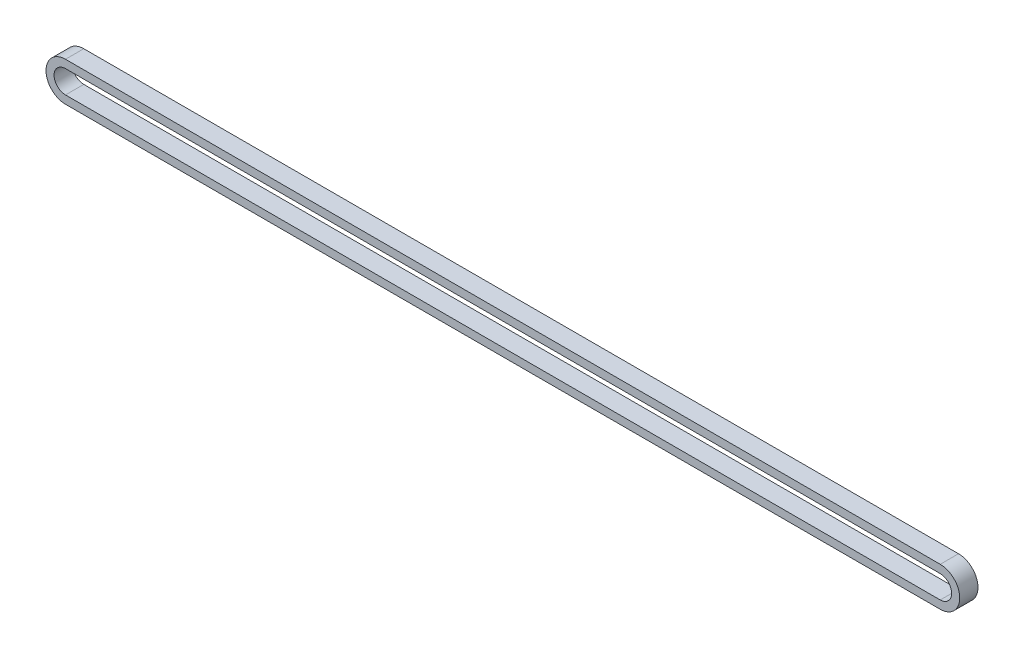
ISO-10303-21;
HEADER;
FILE_DESCRIPTION(('STEP AP214'),'2;1');
FILE_NAME('part.step','',(''),(''),'','','');
FILE_SCHEMA(('AUTOMOTIVE_DESIGN { 1 0 10303 214 1 1 1 1 }'));
ENDSEC;
DATA;
#1=APPLICATION_CONTEXT('core data for automotive mechanical design processes');
#2=APPLICATION_PROTOCOL_DEFINITION('international standard','automotive_design',2000,#1);
#3=PRODUCT_CONTEXT('',#1,'mechanical');
#4=PRODUCT('Part','Part','',(#3));
#5=PRODUCT_RELATED_PRODUCT_CATEGORY('part','',(#4));
#6=PRODUCT_DEFINITION_FORMATION('','',#4);
#7=PRODUCT_DEFINITION_CONTEXT('part definition',#1,'design');
#8=PRODUCT_DEFINITION('design','',#6,#7);
#9=PRODUCT_DEFINITION_SHAPE('','',#8);
#10=(LENGTH_UNIT() NAMED_UNIT(*) SI_UNIT(.MILLI.,.METRE.));
#11=(NAMED_UNIT(*) PLANE_ANGLE_UNIT() SI_UNIT($,.RADIAN.));
#12=(NAMED_UNIT(*) SI_UNIT($,.STERADIAN.) SOLID_ANGLE_UNIT());
#13=UNCERTAINTY_MEASURE_WITH_UNIT(LENGTH_MEASURE(1.E-05),#10,'distance_accuracy_value','');
#14=(GEOMETRIC_REPRESENTATION_CONTEXT(3) GLOBAL_UNCERTAINTY_ASSIGNED_CONTEXT((#13)) GLOBAL_UNIT_ASSIGNED_CONTEXT((#10,
#11,#12)) REPRESENTATION_CONTEXT('',''));
#15=CARTESIAN_POINT('',(0.,0.,0.));
#16=DIRECTION('',(0.,0.,1.));
#17=DIRECTION('',(1.,0.,0.));
#18=AXIS2_PLACEMENT_3D('',#15,#16,#17);
#19=CARTESIAN_POINT('',(0.,0.,-3.));
#20=DIRECTION('',(0.,0.,1.));
#21=DIRECTION('',(1.,0.,0.));
#22=AXIS2_PLACEMENT_3D('',#19,#20,#21);
#23=CYLINDRICAL_SURFACE('',#22,3.20000000000001);
#24=CARTESIAN_POINT('',(0.,0.,0.));
#25=DIRECTION('',(0.,0.,1.));
#26=DIRECTION('',(1.,0.,0.));
#27=AXIS2_PLACEMENT_3D('',#24,#25,#26);
#28=CIRCLE('',#27,3.20000000000001);
#29=CARTESIAN_POINT('',(0.,3.20000000000001,0.));
#30=VERTEX_POINT('',#29);
#31=CARTESIAN_POINT('',(0.,-3.20000000000001,0.));
#32=VERTEX_POINT('',#31);
#33=EDGE_CURVE('E137',#30,#32,#28,.T.);
#34=ORIENTED_EDGE('',*,*,#33,.F.);
#35=DIRECTION('',(0.,0.,1.));
#36=VECTOR('',#35,1.);
#37=CARTESIAN_POINT('',(0.,3.20000000000001,-3.));
#38=LINE('',#37,#36);
#39=CARTESIAN_POINT('',(0.,3.20000000000001,-3.));
#40=VERTEX_POINT('',#39);
#41=EDGE_CURVE('E11',#40,#30,#38,.T.);
#42=ORIENTED_EDGE('',*,*,#41,.F.);
#43=CARTESIAN_POINT('',(0.,0.,-3.));
#44=DIRECTION('',(0.,0.,1.));
#45=DIRECTION('',(1.,0.,0.));
#46=AXIS2_PLACEMENT_3D('',#43,#44,#45);
#47=CIRCLE('',#46,3.20000000000001);
#48=CARTESIAN_POINT('',(0.,-3.20000000000001,-3.));
#49=VERTEX_POINT('',#48);
#50=EDGE_CURVE('E141',#40,#49,#47,.T.);
#51=ORIENTED_EDGE('',*,*,#50,.T.);
#52=DIRECTION('',(0.,0.,1.));
#53=VECTOR('',#52,1.);
#54=CARTESIAN_POINT('',(0.,-3.20000000000001,-3.));
#55=LINE('',#54,#53);
#56=EDGE_CURVE('E42',#49,#32,#55,.T.);
#57=ORIENTED_EDGE('',*,*,#56,.T.);
#58=EDGE_LOOP('',(#34,#42,#51,#57));
#59=FACE_BOUND('',#58,.T.);
#60=ADVANCED_FACE('F39',(#59),#23,.T.);
#61=CARTESIAN_POINT('',(0.,3.20000000000001,-3.));
#62=DIRECTION('',(0.,1.,0.));
#63=DIRECTION('',(0.,0.,1.));
#64=AXIS2_PLACEMENT_3D('',#61,#62,#63);
#65=PLANE('',#64);
#66=DIRECTION('',(-1.,0.,0.));
#67=VECTOR('',#66,1.);
#68=CARTESIAN_POINT('',(0.,3.20000000000001,0.));
#69=LINE('',#68,#67);
#70=CARTESIAN_POINT('',(143.6,3.20000000000001,0.));
#71=VERTEX_POINT('',#70);
#72=EDGE_CURVE('E145',#71,#30,#69,.T.);
#73=ORIENTED_EDGE('',*,*,#72,.F.);
#74=DIRECTION('',(0.,0.,1.));
#75=VECTOR('',#74,1.);
#76=CARTESIAN_POINT('',(143.6,3.20000000000001,-3.));
#77=LINE('',#76,#75);
#78=CARTESIAN_POINT('',(143.6,3.20000000000001,-3.));
#79=VERTEX_POINT('',#78);
#80=EDGE_CURVE('E47',#79,#71,#77,.T.);
#81=ORIENTED_EDGE('',*,*,#80,.F.);
#82=DIRECTION('',(-1.,0.,0.));
#83=VECTOR('',#82,1.);
#84=CARTESIAN_POINT('',(0.,3.20000000000001,-3.));
#85=LINE('',#84,#83);
#86=EDGE_CURVE('E151',#79,#40,#85,.T.);
#87=ORIENTED_EDGE('',*,*,#86,.T.);
#88=ORIENTED_EDGE('',*,*,#41,.T.);
#89=EDGE_LOOP('',(#73,#81,#87,#88));
#90=FACE_BOUND('',#89,.T.);
#91=ADVANCED_FACE('F177',(#90),#65,.T.);
#92=CARTESIAN_POINT('',(143.6,0.,-3.));
#93=DIRECTION('',(0.,0.,1.));
#94=DIRECTION('',(1.,0.,0.));
#95=AXIS2_PLACEMENT_3D('',#92,#93,#94);
#96=CYLINDRICAL_SURFACE('',#95,3.20000000000001);
#97=CARTESIAN_POINT('',(143.6,0.,0.));
#98=DIRECTION('',(0.,0.,1.));
#99=DIRECTION('',(1.,0.,0.));
#100=AXIS2_PLACEMENT_3D('',#97,#98,#99);
#101=CIRCLE('',#100,3.20000000000001);
#102=CARTESIAN_POINT('',(143.6,-3.2,0.));
#103=VERTEX_POINT('',#102);
#104=EDGE_CURVE('E159',#103,#71,#101,.T.);
#105=ORIENTED_EDGE('',*,*,#104,.F.);
#106=DIRECTION('',(0.,0.,1.));
#107=VECTOR('',#106,1.);
#108=CARTESIAN_POINT('',(143.6,-3.2,-3.));
#109=LINE('',#108,#107);
#110=CARTESIAN_POINT('',(143.6,-3.2,-3.));
#111=VERTEX_POINT('',#110);
#112=EDGE_CURVE('E164',#111,#103,#109,.T.);
#113=ORIENTED_EDGE('',*,*,#112,.F.);
#114=CARTESIAN_POINT('',(143.6,0.,-3.));
#115=DIRECTION('',(0.,0.,1.));
#116=DIRECTION('',(1.,0.,0.));
#117=AXIS2_PLACEMENT_3D('',#114,#115,#116);
#118=CIRCLE('',#117,3.20000000000001);
#119=EDGE_CURVE('E148',#111,#79,#118,.T.);
#120=ORIENTED_EDGE('',*,*,#119,.T.);
#121=ORIENTED_EDGE('',*,*,#80,.T.);
#122=EDGE_LOOP('',(#105,#113,#120,#121));
#123=FACE_BOUND('',#122,.T.);
#124=ADVANCED_FACE('F181',(#123),#96,.T.);
#125=CARTESIAN_POINT('',(0.,-3.20000000000001,-3.));
#126=DIRECTION('',(0.,-1.,0.));
#127=DIRECTION('',(0.,0.,-1.));
#128=AXIS2_PLACEMENT_3D('',#125,#126,#127);
#129=PLANE('',#128);
#130=DIRECTION('',(1.,0.,0.));
#131=VECTOR('',#130,1.);
#132=CARTESIAN_POINT('',(0.,-3.20000000000001,0.));
#133=LINE('',#132,#131);
#134=EDGE_CURVE('E156',#32,#103,#133,.T.);
#135=ORIENTED_EDGE('',*,*,#134,.F.);
#136=ORIENTED_EDGE('',*,*,#56,.F.);
#137=DIRECTION('',(1.,0.,0.));
#138=VECTOR('',#137,1.);
#139=CARTESIAN_POINT('',(0.,-3.20000000000001,-3.));
#140=LINE('',#139,#138);
#141=EDGE_CURVE('E144',#49,#111,#140,.T.);
#142=ORIENTED_EDGE('',*,*,#141,.T.);
#143=ORIENTED_EDGE('',*,*,#112,.T.);
#144=EDGE_LOOP('',(#135,#136,#142,#143));
#145=FACE_BOUND('',#144,.T.);
#146=ADVANCED_FACE('F172',(#145),#129,.T.);
#147=CARTESIAN_POINT('',(0.,0.,-3.));
#148=DIRECTION('',(0.,0.,1.));
#149=DIRECTION('',(1.,0.,0.));
#150=AXIS2_PLACEMENT_3D('',#147,#148,#149);
#151=PLANE('',#150);
#152=DIRECTION('',(-1.,0.,0.));
#153=VECTOR('',#152,1.);
#154=CARTESIAN_POINT('',(0.,1.87200000000001,-3.));
#155=LINE('',#154,#153);
#156=CARTESIAN_POINT('',(143.6,1.87200000000001,-3.));
#157=VERTEX_POINT('',#156);
#158=CARTESIAN_POINT('',(0.,1.87200000000001,-3.));
#159=VERTEX_POINT('',#158);
#160=EDGE_CURVE('E112',#157,#159,#155,.T.);
#161=ORIENTED_EDGE('',*,*,#160,.T.);
#162=CARTESIAN_POINT('',(0.,0.,-3.));
#163=DIRECTION('',(0.,0.,1.));
#164=DIRECTION('',(1.,0.,0.));
#165=AXIS2_PLACEMENT_3D('',#162,#163,#164);
#166=CIRCLE('',#165,1.87200000000001);
#167=CARTESIAN_POINT('',(0.,-1.87200000000001,-3.));
#168=VERTEX_POINT('',#167);
#169=EDGE_CURVE('E106',#159,#168,#166,.T.);
#170=ORIENTED_EDGE('',*,*,#169,.T.);
#171=DIRECTION('',(1.,0.,0.));
#172=VECTOR('',#171,1.);
#173=CARTESIAN_POINT('',(0.,-1.87200000000001,-3.));
#174=LINE('',#173,#172);
#175=CARTESIAN_POINT('',(143.6,-1.87200000000001,-3.));
#176=VERTEX_POINT('',#175);
#177=EDGE_CURVE('E115',#168,#176,#174,.T.);
#178=ORIENTED_EDGE('',*,*,#177,.T.);
#179=CARTESIAN_POINT('',(143.6,0.,-3.));
#180=DIRECTION('',(0.,0.,1.));
#181=DIRECTION('',(1.,0.,0.));
#182=AXIS2_PLACEMENT_3D('',#179,#180,#181);
#183=CIRCLE('',#182,1.87200000000001);
#184=EDGE_CURVE('E55',#176,#157,#183,.T.);
#185=ORIENTED_EDGE('',*,*,#184,.T.);
#186=EDGE_LOOP('',(#161,#170,#178,#185));
#187=FACE_BOUND('',#186,.T.);
#188=ORIENTED_EDGE('',*,*,#50,.F.);
#189=ORIENTED_EDGE('',*,*,#86,.F.);
#190=ORIENTED_EDGE('',*,*,#119,.F.);
#191=ORIENTED_EDGE('',*,*,#141,.F.);
#192=EDGE_LOOP('',(#188,#189,#190,#191));
#193=FACE_BOUND('',#192,.T.);
#194=ADVANCED_FACE('F119',(#187,#193),#151,.F.);
#195=CARTESIAN_POINT('',(0.,0.,0.));
#196=DIRECTION('',(0.,0.,1.));
#197=DIRECTION('',(1.,0.,0.));
#198=AXIS2_PLACEMENT_3D('',#195,#196,#197);
#199=PLANE('',#198);
#200=CARTESIAN_POINT('',(0.,0.,0.));
#201=DIRECTION('',(0.,0.,1.));
#202=DIRECTION('',(1.,0.,0.));
#203=AXIS2_PLACEMENT_3D('',#200,#201,#202);
#204=CIRCLE('',#203,1.87200000000001);
#205=CARTESIAN_POINT('',(0.,1.87200000000001,0.));
#206=VERTEX_POINT('',#205);
#207=CARTESIAN_POINT('',(0.,-1.87200000000001,0.));
#208=VERTEX_POINT('',#207);
#209=EDGE_CURVE('E63',#206,#208,#204,.T.);
#210=ORIENTED_EDGE('',*,*,#209,.F.);
#211=DIRECTION('',(-1.,0.,0.));
#212=VECTOR('',#211,1.);
#213=CARTESIAN_POINT('',(0.,1.87200000000001,0.));
#214=LINE('',#213,#212);
#215=CARTESIAN_POINT('',(143.6,1.87200000000001,0.));
#216=VERTEX_POINT('',#215);
#217=EDGE_CURVE('E122',#216,#206,#214,.T.);
#218=ORIENTED_EDGE('',*,*,#217,.F.);
#219=CARTESIAN_POINT('',(143.6,0.,0.));
#220=DIRECTION('',(0.,0.,1.));
#221=DIRECTION('',(1.,0.,0.));
#222=AXIS2_PLACEMENT_3D('',#219,#220,#221);
#223=CIRCLE('',#222,1.87200000000001);
#224=CARTESIAN_POINT('',(143.6,-1.872,0.));
#225=VERTEX_POINT('',#224);
#226=EDGE_CURVE('E125',#225,#216,#223,.T.);
#227=ORIENTED_EDGE('',*,*,#226,.F.);
#228=DIRECTION('',(1.,0.,0.));
#229=VECTOR('',#228,1.);
#230=CARTESIAN_POINT('',(0.,-1.87200000000001,0.));
#231=LINE('',#230,#229);
#232=EDGE_CURVE('E131',#208,#225,#231,.T.);
#233=ORIENTED_EDGE('',*,*,#232,.F.);
#234=EDGE_LOOP('',(#210,#218,#227,#233));
#235=FACE_BOUND('',#234,.T.);
#236=ORIENTED_EDGE('',*,*,#33,.T.);
#237=ORIENTED_EDGE('',*,*,#134,.T.);
#238=ORIENTED_EDGE('',*,*,#104,.T.);
#239=ORIENTED_EDGE('',*,*,#72,.T.);
#240=EDGE_LOOP('',(#236,#237,#238,#239));
#241=FACE_BOUND('',#240,.T.);
#242=ADVANCED_FACE('F174',(#235,#241),#199,.T.);
#243=CARTESIAN_POINT('',(0.,0.,-3.));
#244=DIRECTION('',(0.,0.,1.));
#245=DIRECTION('',(1.,0.,0.));
#246=AXIS2_PLACEMENT_3D('',#243,#244,#245);
#247=CYLINDRICAL_SURFACE('',#246,1.87200000000001);
#248=ORIENTED_EDGE('',*,*,#209,.T.);
#249=DIRECTION('',(0.,0.,1.));
#250=VECTOR('',#249,1.);
#251=CARTESIAN_POINT('',(0.,-1.87200000000001,-3.));
#252=LINE('',#251,#250);
#253=EDGE_CURVE('E102',#168,#208,#252,.T.);
#254=ORIENTED_EDGE('',*,*,#253,.F.);
#255=ORIENTED_EDGE('',*,*,#169,.F.);
#256=DIRECTION('',(0.,0.,1.));
#257=VECTOR('',#256,1.);
#258=CARTESIAN_POINT('',(0.,1.87200000000001,-3.));
#259=LINE('',#258,#257);
#260=EDGE_CURVE('E135',#159,#206,#259,.T.);
#261=ORIENTED_EDGE('',*,*,#260,.T.);
#262=EDGE_LOOP('',(#248,#254,#255,#261));
#263=FACE_BOUND('',#262,.T.);
#264=ADVANCED_FACE('F104',(#263),#247,.F.);
#265=CARTESIAN_POINT('',(0.,1.87200000000001,-3.));
#266=DIRECTION('',(0.,1.,0.));
#267=DIRECTION('',(-1.,0.,0.));
#268=AXIS2_PLACEMENT_3D('',#265,#266,#267);
#269=PLANE('',#268);
#270=ORIENTED_EDGE('',*,*,#217,.T.);
#271=ORIENTED_EDGE('',*,*,#260,.F.);
#272=ORIENTED_EDGE('',*,*,#160,.F.);
#273=DIRECTION('',(0.,0.,1.));
#274=VECTOR('',#273,1.);
#275=CARTESIAN_POINT('',(143.6,1.87200000000001,-3.));
#276=LINE('',#275,#274);
#277=EDGE_CURVE('E138',#157,#216,#276,.T.);
#278=ORIENTED_EDGE('',*,*,#277,.T.);
#279=EDGE_LOOP('',(#270,#271,#272,#278));
#280=FACE_BOUND('',#279,.T.);
#281=ADVANCED_FACE('F234',(#280),#269,.F.);
#282=CARTESIAN_POINT('',(143.6,0.,-3.));
#283=DIRECTION('',(0.,0.,1.));
#284=DIRECTION('',(1.,0.,0.));
#285=AXIS2_PLACEMENT_3D('',#282,#283,#284);
#286=CYLINDRICAL_SURFACE('',#285,1.87200000000001);
#287=ORIENTED_EDGE('',*,*,#226,.T.);
#288=ORIENTED_EDGE('',*,*,#277,.F.);
#289=ORIENTED_EDGE('',*,*,#184,.F.);
#290=DIRECTION('',(0.,0.,1.));
#291=VECTOR('',#290,1.);
#292=CARTESIAN_POINT('',(143.6,-1.872,-3.));
#293=LINE('',#292,#291);
#294=EDGE_CURVE('E111',#176,#225,#293,.T.);
#295=ORIENTED_EDGE('',*,*,#294,.T.);
#296=EDGE_LOOP('',(#287,#288,#289,#295));
#297=FACE_BOUND('',#296,.T.);
#298=ADVANCED_FACE('F243',(#297),#286,.F.);
#299=CARTESIAN_POINT('',(0.,-1.87200000000001,-3.));
#300=DIRECTION('',(0.,-1.,0.));
#301=DIRECTION('',(1.,0.,0.));
#302=AXIS2_PLACEMENT_3D('',#299,#300,#301);
#303=PLANE('',#302);
#304=ORIENTED_EDGE('',*,*,#232,.T.);
#305=ORIENTED_EDGE('',*,*,#294,.F.);
#306=ORIENTED_EDGE('',*,*,#177,.F.);
#307=ORIENTED_EDGE('',*,*,#253,.T.);
#308=EDGE_LOOP('',(#304,#305,#306,#307));
#309=FACE_BOUND('',#308,.T.);
#310=ADVANCED_FACE('F116',(#309),#303,.F.);
#311=CLOSED_SHELL('',(#60,#91,#124,#146,#194,#242,#264,#281,#298,#310));
#312=MANIFOLD_SOLID_BREP('B2',#311);
#313=ADVANCED_BREP_SHAPE_REPRESENTATION('',(#18,#312),#14);
#314=SHAPE_DEFINITION_REPRESENTATION(#9,#313);
ENDSEC;
END-ISO-10303-21;
